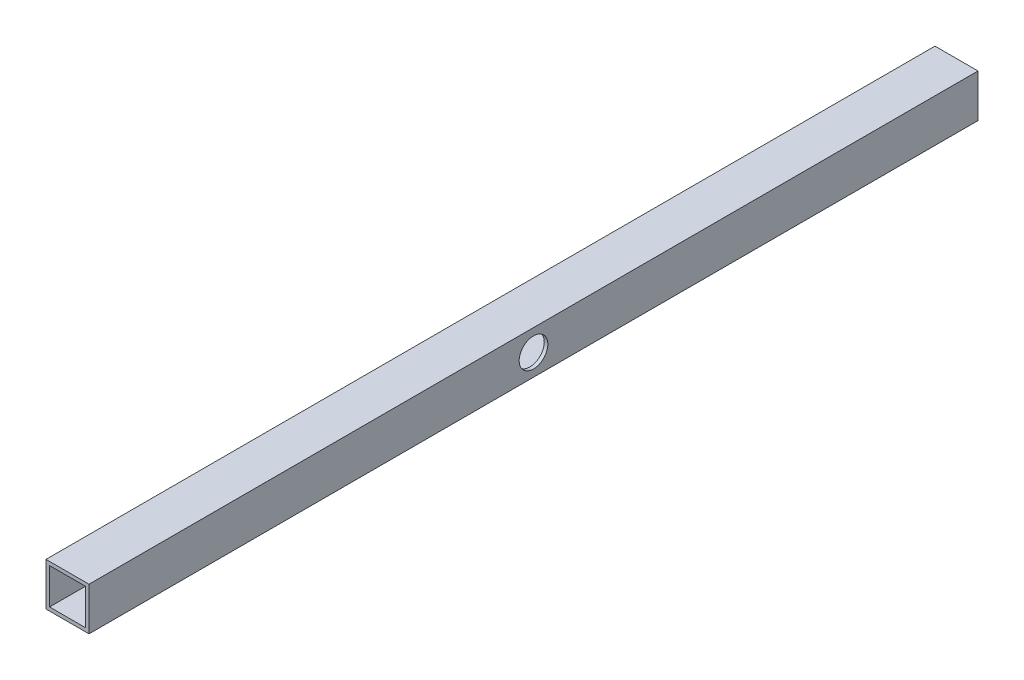
ISO-10303-21;
HEADER;
FILE_DESCRIPTION(('STEP AP214'),'2;1');
FILE_NAME('part.step','',(''),(''),'','','');
FILE_SCHEMA(('AUTOMOTIVE_DESIGN { 1 0 10303 214 1 1 1 1 }'));
ENDSEC;
DATA;
#1=APPLICATION_CONTEXT('core data for automotive mechanical design processes');
#2=APPLICATION_PROTOCOL_DEFINITION('international standard','automotive_design',2000,#1);
#3=PRODUCT_CONTEXT('',#1,'mechanical');
#4=PRODUCT('Part','Part','',(#3));
#5=PRODUCT_RELATED_PRODUCT_CATEGORY('part','',(#4));
#6=PRODUCT_DEFINITION_FORMATION('','',#4);
#7=PRODUCT_DEFINITION_CONTEXT('part definition',#1,'design');
#8=PRODUCT_DEFINITION('design','',#6,#7);
#9=PRODUCT_DEFINITION_SHAPE('','',#8);
#10=(LENGTH_UNIT() NAMED_UNIT(*) SI_UNIT(.MILLI.,.METRE.));
#11=(NAMED_UNIT(*) PLANE_ANGLE_UNIT() SI_UNIT($,.RADIAN.));
#12=(NAMED_UNIT(*) SI_UNIT($,.STERADIAN.) SOLID_ANGLE_UNIT());
#13=UNCERTAINTY_MEASURE_WITH_UNIT(LENGTH_MEASURE(1.E-05),#10,'distance_accuracy_value','');
#14=(GEOMETRIC_REPRESENTATION_CONTEXT(3) GLOBAL_UNCERTAINTY_ASSIGNED_CONTEXT((#13)) GLOBAL_UNIT_ASSIGNED_CONTEXT((#10,
#11,#12)) REPRESENTATION_CONTEXT('',''));
#15=CARTESIAN_POINT('',(0.,0.,0.));
#16=DIRECTION('',(0.,0.,1.));
#17=DIRECTION('',(1.,0.,0.));
#18=AXIS2_PLACEMENT_3D('',#15,#16,#17);
#19=CARTESIAN_POINT('',(0.,0.,196.85));
#20=DIRECTION('',(0.,0.,-1.));
#21=DIRECTION('',(-1.,0.,0.));
#22=AXIS2_PLACEMENT_3D('',#19,#20,#21);
#23=PLANE('',#22);
#24=DIRECTION('',(0.,1.,0.));
#25=VECTOR('',#24,1.);
#26=CARTESIAN_POINT('',(9.525,-9.525,196.85));
#27=LINE('',#26,#25);
#28=CARTESIAN_POINT('',(9.525,-9.525,196.85));
#29=VERTEX_POINT('',#28);
#30=CARTESIAN_POINT('',(9.525,9.525,196.85));
#31=VERTEX_POINT('',#30);
#32=EDGE_CURVE('E137',#29,#31,#27,.T.);
#33=ORIENTED_EDGE('',*,*,#32,.T.);
#34=DIRECTION('',(-1.,0.,0.));
#35=VECTOR('',#34,1.);
#36=CARTESIAN_POINT('',(-9.525,9.525,196.85));
#37=LINE('',#36,#35);
#38=CARTESIAN_POINT('',(-9.525,9.525,196.85));
#39=VERTEX_POINT('',#38);
#40=EDGE_CURVE('E140',#31,#39,#37,.T.);
#41=ORIENTED_EDGE('',*,*,#40,.T.);
#42=DIRECTION('',(0.,-1.,0.));
#43=VECTOR('',#42,1.);
#44=CARTESIAN_POINT('',(-9.525,-9.525,196.85));
#45=LINE('',#44,#43);
#46=CARTESIAN_POINT('',(-9.525,-9.525,196.85));
#47=VERTEX_POINT('',#46);
#48=EDGE_CURVE('E143',#39,#47,#45,.T.);
#49=ORIENTED_EDGE('',*,*,#48,.T.);
#50=DIRECTION('',(1.,0.,0.));
#51=VECTOR('',#50,1.);
#52=CARTESIAN_POINT('',(-9.525,-9.525,196.85));
#53=LINE('',#52,#51);
#54=EDGE_CURVE('E145',#47,#29,#53,.T.);
#55=ORIENTED_EDGE('',*,*,#54,.T.);
#56=EDGE_LOOP('',(#33,#41,#49,#55));
#57=FACE_BOUND('',#56,.T.);
#58=DIRECTION('',(0.,1.,0.));
#59=VECTOR('',#58,1.);
#60=CARTESIAN_POINT('',(7.9375,-7.9375,196.85));
#61=LINE('',#60,#59);
#62=CARTESIAN_POINT('',(7.9375,-7.9375,196.85));
#63=VERTEX_POINT('',#62);
#64=CARTESIAN_POINT('',(7.9375,7.9375,196.85));
#65=VERTEX_POINT('',#64);
#66=EDGE_CURVE('E99',#63,#65,#61,.T.);
#67=ORIENTED_EDGE('',*,*,#66,.F.);
#68=DIRECTION('',(1.,0.,0.));
#69=VECTOR('',#68,1.);
#70=CARTESIAN_POINT('',(-7.9375,-7.9375,196.85));
#71=LINE('',#70,#69);
#72=CARTESIAN_POINT('',(-7.9375,-7.9375,196.85));
#73=VERTEX_POINT('',#72);
#74=EDGE_CURVE('E121',#73,#63,#71,.T.);
#75=ORIENTED_EDGE('',*,*,#74,.F.);
#76=DIRECTION('',(0.,-1.,0.));
#77=VECTOR('',#76,1.);
#78=CARTESIAN_POINT('',(-7.9375,-7.9375,196.85));
#79=LINE('',#78,#77);
#80=CARTESIAN_POINT('',(-7.9375,7.9375,196.85));
#81=VERTEX_POINT('',#80);
#82=EDGE_CURVE('E119',#81,#73,#79,.T.);
#83=ORIENTED_EDGE('',*,*,#82,.F.);
#84=DIRECTION('',(-1.,0.,0.));
#85=VECTOR('',#84,1.);
#86=CARTESIAN_POINT('',(-7.9375,7.9375,196.85));
#87=LINE('',#86,#85);
#88=EDGE_CURVE('E107',#65,#81,#87,.T.);
#89=ORIENTED_EDGE('',*,*,#88,.F.);
#90=EDGE_LOOP('',(#67,#75,#83,#89));
#91=FACE_BOUND('',#90,.T.);
#92=ADVANCED_FACE('F33',(#57,#91),#23,.F.);
#93=CARTESIAN_POINT('',(0.,0.,-196.85));
#94=DIRECTION('',(0.,0.,-1.));
#95=DIRECTION('',(-1.,0.,0.));
#96=AXIS2_PLACEMENT_3D('',#93,#94,#95);
#97=PLANE('',#96);
#98=DIRECTION('',(0.,1.,0.));
#99=VECTOR('',#98,1.);
#100=CARTESIAN_POINT('',(9.525,-9.525,-196.85));
#101=LINE('',#100,#99);
#102=CARTESIAN_POINT('',(9.525,-9.525,-196.85));
#103=VERTEX_POINT('',#102);
#104=CARTESIAN_POINT('',(9.525,9.525,-196.85));
#105=VERTEX_POINT('',#104);
#106=EDGE_CURVE('E115',#103,#105,#101,.T.);
#107=ORIENTED_EDGE('',*,*,#106,.F.);
#108=DIRECTION('',(1.,0.,0.));
#109=VECTOR('',#108,1.);
#110=CARTESIAN_POINT('',(-9.525,-9.525,-196.85));
#111=LINE('',#110,#109);
#112=CARTESIAN_POINT('',(-9.525,-9.525,-196.85));
#113=VERTEX_POINT('',#112);
#114=EDGE_CURVE('E141',#113,#103,#111,.T.);
#115=ORIENTED_EDGE('',*,*,#114,.F.);
#116=DIRECTION('',(0.,-1.,0.));
#117=VECTOR('',#116,1.);
#118=CARTESIAN_POINT('',(-9.525,-9.525,-196.85));
#119=LINE('',#118,#117);
#120=CARTESIAN_POINT('',(-9.525,9.525,-196.85));
#121=VERTEX_POINT('',#120);
#122=EDGE_CURVE('E152',#121,#113,#119,.T.);
#123=ORIENTED_EDGE('',*,*,#122,.F.);
#124=DIRECTION('',(-1.,0.,0.));
#125=VECTOR('',#124,1.);
#126=CARTESIAN_POINT('',(-9.525,9.525,-196.85));
#127=LINE('',#126,#125);
#128=EDGE_CURVE('E150',#105,#121,#127,.T.);
#129=ORIENTED_EDGE('',*,*,#128,.F.);
#130=EDGE_LOOP('',(#107,#115,#123,#129));
#131=FACE_BOUND('',#130,.T.);
#132=DIRECTION('',(1.,0.,0.));
#133=VECTOR('',#132,1.);
#134=CARTESIAN_POINT('',(-7.9375,-7.9375,-196.85));
#135=LINE('',#134,#133);
#136=CARTESIAN_POINT('',(-7.9375,-7.9375,-196.85));
#137=VERTEX_POINT('',#136);
#138=CARTESIAN_POINT('',(7.9375,-7.9375,-196.85));
#139=VERTEX_POINT('',#138);
#140=EDGE_CURVE('E108',#137,#139,#135,.T.);
#141=ORIENTED_EDGE('',*,*,#140,.T.);
#142=DIRECTION('',(0.,1.,0.));
#143=VECTOR('',#142,1.);
#144=CARTESIAN_POINT('',(7.9375,-7.9375,-196.85));
#145=LINE('',#144,#143);
#146=CARTESIAN_POINT('',(7.9375,7.9375,-196.85));
#147=VERTEX_POINT('',#146);
#148=EDGE_CURVE('E57',#139,#147,#145,.T.);
#149=ORIENTED_EDGE('',*,*,#148,.T.);
#150=DIRECTION('',(-1.,0.,0.));
#151=VECTOR('',#150,1.);
#152=CARTESIAN_POINT('',(-7.9375,7.9375,-196.85));
#153=LINE('',#152,#151);
#154=CARTESIAN_POINT('',(-7.9375,7.9375,-196.85));
#155=VERTEX_POINT('',#154);
#156=EDGE_CURVE('E114',#147,#155,#153,.T.);
#157=ORIENTED_EDGE('',*,*,#156,.T.);
#158=DIRECTION('',(0.,-1.,0.));
#159=VECTOR('',#158,1.);
#160=CARTESIAN_POINT('',(-7.9375,-7.9375,-196.85));
#161=LINE('',#160,#159);
#162=EDGE_CURVE('E129',#155,#137,#161,.T.);
#163=ORIENTED_EDGE('',*,*,#162,.T.);
#164=EDGE_LOOP('',(#141,#149,#157,#163));
#165=FACE_BOUND('',#164,.T.);
#166=ADVANCED_FACE('F171',(#131,#165),#97,.T.);
#167=CARTESIAN_POINT('',(9.525,-9.525,196.85));
#168=DIRECTION('',(-1.,0.,0.));
#169=DIRECTION('',(0.,0.,1.));
#170=AXIS2_PLACEMENT_3D('',#167,#168,#169);
#171=PLANE('',#170);
#172=CARTESIAN_POINT('',(9.525,0.,0.));
#173=DIRECTION('',(1.,0.,0.));
#174=DIRECTION('',(0.,0.,-1.));
#175=AXIS2_PLACEMENT_3D('',#172,#173,#174);
#176=CIRCLE('',#175,6.35);
#177=CARTESIAN_POINT('',(9.525,0.,-6.35));
#178=VERTEX_POINT('',#177);
#179=EDGE_CURVE('E219',#178,#178,#176,.T.);
#180=ORIENTED_EDGE('',*,*,#179,.F.);
#181=EDGE_LOOP('',(#180));
#182=FACE_BOUND('',#181,.T.);
#183=ORIENTED_EDGE('',*,*,#106,.T.);
#184=DIRECTION('',(0.,0.,-1.));
#185=VECTOR('',#184,1.);
#186=CARTESIAN_POINT('',(9.525,9.525,196.85));
#187=LINE('',#186,#185);
#188=EDGE_CURVE('E11',#31,#105,#187,.T.);
#189=ORIENTED_EDGE('',*,*,#188,.F.);
#190=ORIENTED_EDGE('',*,*,#32,.F.);
#191=DIRECTION('',(0.,0.,-1.));
#192=VECTOR('',#191,1.);
#193=CARTESIAN_POINT('',(9.525,-9.525,196.85));
#194=LINE('',#193,#192);
#195=EDGE_CURVE('E147',#29,#103,#194,.T.);
#196=ORIENTED_EDGE('',*,*,#195,.T.);
#197=EDGE_LOOP('',(#183,#189,#190,#196));
#198=FACE_BOUND('',#197,.T.);
#199=ADVANCED_FACE('F35',(#182,#198),#171,.F.);
#200=CARTESIAN_POINT('',(-9.525,9.525,196.85));
#201=DIRECTION('',(0.,-1.,0.));
#202=DIRECTION('',(0.,0.,-1.));
#203=AXIS2_PLACEMENT_3D('',#200,#201,#202);
#204=PLANE('',#203);
#205=ORIENTED_EDGE('',*,*,#128,.T.);
#206=DIRECTION('',(0.,0.,-1.));
#207=VECTOR('',#206,1.);
#208=CARTESIAN_POINT('',(-9.525,9.525,196.85));
#209=LINE('',#208,#207);
#210=EDGE_CURVE('E42',#39,#121,#209,.T.);
#211=ORIENTED_EDGE('',*,*,#210,.F.);
#212=ORIENTED_EDGE('',*,*,#40,.F.);
#213=ORIENTED_EDGE('',*,*,#188,.T.);
#214=EDGE_LOOP('',(#205,#211,#212,#213));
#215=FACE_BOUND('',#214,.T.);
#216=ADVANCED_FACE('F181',(#215),#204,.F.);
#217=CARTESIAN_POINT('',(-9.525,-9.525,196.85));
#218=DIRECTION('',(1.,0.,0.));
#219=DIRECTION('',(0.,0.,-1.));
#220=AXIS2_PLACEMENT_3D('',#217,#218,#219);
#221=PLANE('',#220);
#222=CARTESIAN_POINT('',(-9.525,0.,0.));
#223=DIRECTION('',(1.,0.,0.));
#224=DIRECTION('',(0.,0.,-1.));
#225=AXIS2_PLACEMENT_3D('',#222,#223,#224);
#226=CIRCLE('',#225,6.35);
#227=CARTESIAN_POINT('',(-9.525,0.,-6.35));
#228=VERTEX_POINT('',#227);
#229=EDGE_CURVE('E215',#228,#228,#226,.T.);
#230=ORIENTED_EDGE('',*,*,#229,.T.);
#231=EDGE_LOOP('',(#230));
#232=FACE_BOUND('',#231,.T.);
#233=ORIENTED_EDGE('',*,*,#122,.T.);
#234=DIRECTION('',(0.,0.,-1.));
#235=VECTOR('',#234,1.);
#236=CARTESIAN_POINT('',(-9.525,-9.525,196.85));
#237=LINE('',#236,#235);
#238=EDGE_CURVE('E157',#47,#113,#237,.T.);
#239=ORIENTED_EDGE('',*,*,#238,.F.);
#240=ORIENTED_EDGE('',*,*,#48,.F.);
#241=ORIENTED_EDGE('',*,*,#210,.T.);
#242=EDGE_LOOP('',(#233,#239,#240,#241));
#243=FACE_BOUND('',#242,.T.);
#244=ADVANCED_FACE('F165',(#232,#243),#221,.F.);
#245=CARTESIAN_POINT('',(-9.525,-9.525,196.85));
#246=DIRECTION('',(0.,1.,0.));
#247=DIRECTION('',(0.,0.,1.));
#248=AXIS2_PLACEMENT_3D('',#245,#246,#247);
#249=PLANE('',#248);
#250=ORIENTED_EDGE('',*,*,#114,.T.);
#251=ORIENTED_EDGE('',*,*,#195,.F.);
#252=ORIENTED_EDGE('',*,*,#54,.F.);
#253=ORIENTED_EDGE('',*,*,#238,.T.);
#254=EDGE_LOOP('',(#250,#251,#252,#253));
#255=FACE_BOUND('',#254,.T.);
#256=ADVANCED_FACE('F175',(#255),#249,.F.);
#257=CARTESIAN_POINT('',(7.9375,-7.9375,196.85));
#258=DIRECTION('',(-1.,0.,0.));
#259=DIRECTION('',(0.,-1.,0.));
#260=AXIS2_PLACEMENT_3D('',#257,#258,#259);
#261=PLANE('',#260);
#262=CARTESIAN_POINT('',(7.9375,0.,0.));
#263=DIRECTION('',(-1.,0.,0.));
#264=DIRECTION('',(0.,-1.,0.));
#265=AXIS2_PLACEMENT_3D('',#262,#263,#264);
#266=CIRCLE('',#265,6.35);
#267=CARTESIAN_POINT('',(7.9375,0.,-6.35));
#268=VERTEX_POINT('',#267);
#269=EDGE_CURVE('E127',#268,#268,#266,.T.);
#270=ORIENTED_EDGE('',*,*,#269,.F.);
#271=EDGE_LOOP('',(#270));
#272=FACE_BOUND('',#271,.T.);
#273=ORIENTED_EDGE('',*,*,#148,.F.);
#274=DIRECTION('',(0.,0.,-1.));
#275=VECTOR('',#274,1.);
#276=CARTESIAN_POINT('',(7.9375,-7.9375,196.85));
#277=LINE('',#276,#275);
#278=EDGE_CURVE('E103',#63,#139,#277,.T.);
#279=ORIENTED_EDGE('',*,*,#278,.F.);
#280=ORIENTED_EDGE('',*,*,#66,.T.);
#281=DIRECTION('',(0.,0.,-1.));
#282=VECTOR('',#281,1.);
#283=CARTESIAN_POINT('',(7.9375,7.9375,196.85));
#284=LINE('',#283,#282);
#285=EDGE_CURVE('E102',#65,#147,#284,.T.);
#286=ORIENTED_EDGE('',*,*,#285,.T.);
#287=EDGE_LOOP('',(#273,#279,#280,#286));
#288=FACE_BOUND('',#287,.T.);
#289=ADVANCED_FACE('F101',(#272,#288),#261,.T.);
#290=CARTESIAN_POINT('',(-7.9375,7.9375,196.85));
#291=DIRECTION('',(0.,-1.,0.));
#292=DIRECTION('',(0.,0.,-1.));
#293=AXIS2_PLACEMENT_3D('',#290,#291,#292);
#294=PLANE('',#293);
#295=ORIENTED_EDGE('',*,*,#156,.F.);
#296=ORIENTED_EDGE('',*,*,#285,.F.);
#297=ORIENTED_EDGE('',*,*,#88,.T.);
#298=DIRECTION('',(0.,0.,-1.));
#299=VECTOR('',#298,1.);
#300=CARTESIAN_POINT('',(-7.9375,7.9375,196.85));
#301=LINE('',#300,#299);
#302=EDGE_CURVE('E116',#81,#155,#301,.T.);
#303=ORIENTED_EDGE('',*,*,#302,.T.);
#304=EDGE_LOOP('',(#295,#296,#297,#303));
#305=FACE_BOUND('',#304,.T.);
#306=ADVANCED_FACE('F111',(#305),#294,.T.);
#307=CARTESIAN_POINT('',(-7.9375,-7.9375,196.85));
#308=DIRECTION('',(1.,0.,0.));
#309=DIRECTION('',(0.,0.,-1.));
#310=AXIS2_PLACEMENT_3D('',#307,#308,#309);
#311=PLANE('',#310);
#312=CARTESIAN_POINT('',(-7.9375,0.,0.));
#313=DIRECTION('',(1.,0.,0.));
#314=DIRECTION('',(0.,0.,-1.));
#315=AXIS2_PLACEMENT_3D('',#312,#313,#314);
#316=CIRCLE('',#315,6.35);
#317=CARTESIAN_POINT('',(-7.9375,0.,-6.35));
#318=VERTEX_POINT('',#317);
#319=EDGE_CURVE('E37',#318,#318,#316,.T.);
#320=ORIENTED_EDGE('',*,*,#319,.F.);
#321=EDGE_LOOP('',(#320));
#322=FACE_BOUND('',#321,.T.);
#323=ORIENTED_EDGE('',*,*,#162,.F.);
#324=ORIENTED_EDGE('',*,*,#302,.F.);
#325=ORIENTED_EDGE('',*,*,#82,.T.);
#326=DIRECTION('',(0.,0.,-1.));
#327=VECTOR('',#326,1.);
#328=CARTESIAN_POINT('',(-7.9375,-7.9375,196.85));
#329=LINE('',#328,#327);
#330=EDGE_CURVE('E49',#73,#137,#329,.T.);
#331=ORIENTED_EDGE('',*,*,#330,.T.);
#332=EDGE_LOOP('',(#323,#324,#325,#331));
#333=FACE_BOUND('',#332,.T.);
#334=ADVANCED_FACE('F210',(#322,#333),#311,.T.);
#335=CARTESIAN_POINT('',(-7.9375,-7.9375,196.85));
#336=DIRECTION('',(0.,1.,0.));
#337=DIRECTION('',(0.,0.,1.));
#338=AXIS2_PLACEMENT_3D('',#335,#336,#337);
#339=PLANE('',#338);
#340=ORIENTED_EDGE('',*,*,#140,.F.);
#341=ORIENTED_EDGE('',*,*,#330,.F.);
#342=ORIENTED_EDGE('',*,*,#74,.T.);
#343=ORIENTED_EDGE('',*,*,#278,.T.);
#344=EDGE_LOOP('',(#340,#341,#342,#343));
#345=FACE_BOUND('',#344,.T.);
#346=ADVANCED_FACE('F230',(#345),#339,.T.);
#347=CARTESIAN_POINT('',(-9.525,0.,0.));
#348=DIRECTION('',(1.,0.,0.));
#349=DIRECTION('',(0.,0.,-1.));
#350=AXIS2_PLACEMENT_3D('',#347,#348,#349);
#351=CYLINDRICAL_SURFACE('',#350,6.35);
#352=CARTESIAN_POINT('',(-7.9375,0.,-6.35));
#353=CARTESIAN_POINT('',(-7.95403645833333,0.,-6.35));
#354=CARTESIAN_POINT('',(-7.97057291666667,0.,-6.35));
#355=CARTESIAN_POINT('',(-8.00364583333334,0.,-6.35));
#356=CARTESIAN_POINT('',(-8.02018229166667,0.,-6.35));
#357=CARTESIAN_POINT('',(-8.05325520833333,0.,-6.35));
#358=CARTESIAN_POINT('',(-8.06979166666667,0.,-6.35));
#359=CARTESIAN_POINT('',(-8.10286458333333,0.,-6.35));
#360=CARTESIAN_POINT('',(-8.11940104166667,0.,-6.35));
#361=CARTESIAN_POINT('',(-8.15247395833333,0.,-6.35));
#362=CARTESIAN_POINT('',(-8.16901041666667,0.,-6.35));
#363=CARTESIAN_POINT('',(-8.20208333333334,0.,-6.35));
#364=CARTESIAN_POINT('',(-8.21861979166667,0.,-6.35));
#365=CARTESIAN_POINT('',(-8.25169270833333,0.,-6.35));
#366=CARTESIAN_POINT('',(-8.26822916666667,0.,-6.35));
#367=CARTESIAN_POINT('',(-8.30130208333333,0.,-6.35));
#368=CARTESIAN_POINT('',(-8.31783854166667,0.,-6.35));
#369=CARTESIAN_POINT('',(-8.35091145833333,0.,-6.35));
#370=CARTESIAN_POINT('',(-8.36744791666667,0.,-6.35));
#371=CARTESIAN_POINT('',(-8.40052083333333,0.,-6.35));
#372=CARTESIAN_POINT('',(-8.41705729166667,0.,-6.35));
#373=CARTESIAN_POINT('',(-8.45013020833333,0.,-6.35));
#374=CARTESIAN_POINT('',(-8.46666666666667,0.,-6.35));
#375=CARTESIAN_POINT('',(-8.49973958333333,0.,-6.35));
#376=CARTESIAN_POINT('',(-8.51627604166667,0.,-6.35));
#377=CARTESIAN_POINT('',(-8.54934895833333,0.,-6.35));
#378=CARTESIAN_POINT('',(-8.56588541666667,0.,-6.35));
#379=CARTESIAN_POINT('',(-8.59895833333334,0.,-6.35));
#380=CARTESIAN_POINT('',(-8.61549479166667,0.,-6.35));
#381=CARTESIAN_POINT('',(-8.64856770833333,0.,-6.35));
#382=CARTESIAN_POINT('',(-8.66510416666667,0.,-6.35));
#383=CARTESIAN_POINT('',(-8.69817708333333,0.,-6.35));
#384=CARTESIAN_POINT('',(-8.71471354166667,0.,-6.35));
#385=CARTESIAN_POINT('',(-8.74778645833334,0.,-6.35));
#386=CARTESIAN_POINT('',(-8.76432291666667,0.,-6.35));
#387=CARTESIAN_POINT('',(-8.79739583333333,0.,-6.35));
#388=CARTESIAN_POINT('',(-8.81393229166667,0.,-6.35));
#389=CARTESIAN_POINT('',(-8.84700520833333,0.,-6.35));
#390=CARTESIAN_POINT('',(-8.86354166666667,0.,-6.35));
#391=CARTESIAN_POINT('',(-8.89661458333333,0.,-6.35));
#392=CARTESIAN_POINT('',(-8.91315104166667,0.,-6.35));
#393=CARTESIAN_POINT('',(-8.94622395833333,0.,-6.35));
#394=CARTESIAN_POINT('',(-8.96276041666667,0.,-6.35));
#395=CARTESIAN_POINT('',(-8.99583333333334,0.,-6.35));
#396=CARTESIAN_POINT('',(-9.01236979166667,0.,-6.35));
#397=CARTESIAN_POINT('',(-9.04544270833333,0.,-6.35));
#398=CARTESIAN_POINT('',(-9.06197916666667,0.,-6.35));
#399=CARTESIAN_POINT('',(-9.09505208333333,0.,-6.35));
#400=CARTESIAN_POINT('',(-9.11158854166667,0.,-6.35));
#401=CARTESIAN_POINT('',(-9.14466145833333,0.,-6.35));
#402=CARTESIAN_POINT('',(-9.16119791666667,0.,-6.35));
#403=CARTESIAN_POINT('',(-9.19427083333334,0.,-6.35));
#404=CARTESIAN_POINT('',(-9.21080729166667,0.,-6.35));
#405=CARTESIAN_POINT('',(-9.24388020833333,0.,-6.35));
#406=CARTESIAN_POINT('',(-9.26041666666667,0.,-6.35));
#407=CARTESIAN_POINT('',(-9.29348958333333,0.,-6.35));
#408=CARTESIAN_POINT('',(-9.31002604166667,0.,-6.35));
#409=CARTESIAN_POINT('',(-9.34309895833334,0.,-6.35));
#410=CARTESIAN_POINT('',(-9.35963541666667,0.,-6.35));
#411=CARTESIAN_POINT('',(-9.39270833333333,0.,-6.35));
#412=CARTESIAN_POINT('',(-9.40924479166667,0.,-6.35));
#413=CARTESIAN_POINT('',(-9.44231770833333,0.,-6.35));
#414=CARTESIAN_POINT('',(-9.45885416666667,0.,-6.35));
#415=CARTESIAN_POINT('',(-9.49192708333333,0.,-6.35));
#416=CARTESIAN_POINT('',(-9.50846354166667,0.,-6.35));
#417=CARTESIAN_POINT('',(-9.525,0.,-6.35));
#418=B_SPLINE_CURVE_WITH_KNOTS('',3,(#352,#353,#354,#355,#356,#357,#358,#359,#360,#361,#362,
#363,#364,#365,#366,#367,#368,#369,#370,#371,#372,#373,#374,#375,#376,#377,#378,#379,#380,#381,
#382,#383,#384,#385,#386,#387,#388,#389,#390,#391,#392,#393,#394,#395,#396,#397,#398,#399,#400,
#401,#402,#403,#404,#405,#406,#407,#408,#409,#410,#411,#412,#413,#414,#415,#416,#417),
.UNSPECIFIED.,.F.,.F.,(4,2,2,2,2,2,2,2,2,2,2,2,2,2,2,2,2,2,2,2,2,2,2,2,2,2,2,2,2,2,2,2,4),(0.,
0.0496093749999989,0.0992187499999995,0.148828125,0.198437499999999,0.248046875,0.29765625,
0.347265624999999,0.396875,0.446484374999999,0.496093749999999,0.545703125,0.595312499999999,
0.644921874999999,0.69453125,0.744140624999999,0.793749999999999,0.843359375,0.892968749999999,
0.942578124999999,0.9921875,1.041796875,1.09140625,1.141015625,1.190625,1.240234375,1.28984375,
1.339453125,1.3890625,1.438671875,1.48828125,1.537890625,1.5875),.UNSPECIFIED.);
#419=EDGE_CURVE('BSEAM225',#318,#228,#418,.T.);
#420=ORIENTED_EDGE('',*,*,#319,.T.);
#421=ORIENTED_EDGE('',*,*,#229,.F.);
#422=ORIENTED_EDGE('',*,*,#419,.T.);
#423=ORIENTED_EDGE('',*,*,#419,.F.);
#424=EDGE_LOOP('',(#420,#422,#421,#423));
#425=FACE_BOUND('',#424,.T.);
#426=ADVANCED_FACE('F225',(#425),#351,.F.);
#427=CARTESIAN_POINT('',(7.9375,0.,-6.35));
#428=CARTESIAN_POINT('',(7.95403645833333,0.,-6.35));
#429=CARTESIAN_POINT('',(7.97057291666667,0.,-6.35));
#430=CARTESIAN_POINT('',(8.00364583333334,0.,-6.35));
#431=CARTESIAN_POINT('',(8.02018229166667,0.,-6.35));
#432=CARTESIAN_POINT('',(8.05325520833333,0.,-6.35));
#433=CARTESIAN_POINT('',(8.06979166666667,0.,-6.35));
#434=CARTESIAN_POINT('',(8.10286458333333,0.,-6.35));
#435=CARTESIAN_POINT('',(8.11940104166667,0.,-6.35));
#436=CARTESIAN_POINT('',(8.15247395833333,0.,-6.35));
#437=CARTESIAN_POINT('',(8.16901041666667,0.,-6.35));
#438=CARTESIAN_POINT('',(8.20208333333334,0.,-6.35));
#439=CARTESIAN_POINT('',(8.21861979166667,0.,-6.35));
#440=CARTESIAN_POINT('',(8.25169270833333,0.,-6.35));
#441=CARTESIAN_POINT('',(8.26822916666667,0.,-6.35));
#442=CARTESIAN_POINT('',(8.30130208333333,0.,-6.35));
#443=CARTESIAN_POINT('',(8.31783854166667,0.,-6.35));
#444=CARTESIAN_POINT('',(8.35091145833333,0.,-6.35));
#445=CARTESIAN_POINT('',(8.36744791666667,0.,-6.35));
#446=CARTESIAN_POINT('',(8.40052083333333,0.,-6.35));
#447=CARTESIAN_POINT('',(8.41705729166667,0.,-6.35));
#448=CARTESIAN_POINT('',(8.45013020833333,0.,-6.35));
#449=CARTESIAN_POINT('',(8.46666666666667,0.,-6.35));
#450=CARTESIAN_POINT('',(8.49973958333333,0.,-6.35));
#451=CARTESIAN_POINT('',(8.51627604166667,0.,-6.35));
#452=CARTESIAN_POINT('',(8.54934895833333,0.,-6.35));
#453=CARTESIAN_POINT('',(8.56588541666667,0.,-6.35));
#454=CARTESIAN_POINT('',(8.59895833333333,0.,-6.35));
#455=CARTESIAN_POINT('',(8.61549479166667,0.,-6.35));
#456=CARTESIAN_POINT('',(8.64856770833333,0.,-6.35));
#457=CARTESIAN_POINT('',(8.66510416666667,0.,-6.35));
#458=CARTESIAN_POINT('',(8.69817708333333,0.,-6.35));
#459=CARTESIAN_POINT('',(8.71471354166667,0.,-6.35));
#460=CARTESIAN_POINT('',(8.74778645833333,0.,-6.35));
#461=CARTESIAN_POINT('',(8.76432291666667,0.,-6.35));
#462=CARTESIAN_POINT('',(8.79739583333333,0.,-6.35));
#463=CARTESIAN_POINT('',(8.81393229166667,0.,-6.35));
#464=CARTESIAN_POINT('',(8.84700520833333,0.,-6.35));
#465=CARTESIAN_POINT('',(8.86354166666667,0.,-6.35));
#466=CARTESIAN_POINT('',(8.89661458333333,0.,-6.35));
#467=CARTESIAN_POINT('',(8.91315104166667,0.,-6.35));
#468=CARTESIAN_POINT('',(8.94622395833333,0.,-6.35));
#469=CARTESIAN_POINT('',(8.96276041666667,0.,-6.35));
#470=CARTESIAN_POINT('',(8.99583333333334,0.,-6.35));
#471=CARTESIAN_POINT('',(9.01236979166667,0.,-6.35));
#472=CARTESIAN_POINT('',(9.04544270833333,0.,-6.35));
#473=CARTESIAN_POINT('',(9.06197916666667,0.,-6.35));
#474=CARTESIAN_POINT('',(9.09505208333333,0.,-6.35));
#475=CARTESIAN_POINT('',(9.11158854166667,0.,-6.35));
#476=CARTESIAN_POINT('',(9.14466145833333,0.,-6.35));
#477=CARTESIAN_POINT('',(9.16119791666667,0.,-6.35));
#478=CARTESIAN_POINT('',(9.19427083333333,0.,-6.35));
#479=CARTESIAN_POINT('',(9.21080729166667,0.,-6.35));
#480=CARTESIAN_POINT('',(9.24388020833333,0.,-6.35));
#481=CARTESIAN_POINT('',(9.26041666666667,0.,-6.35));
#482=CARTESIAN_POINT('',(9.29348958333333,0.,-6.35));
#483=CARTESIAN_POINT('',(9.31002604166667,0.,-6.35));
#484=CARTESIAN_POINT('',(9.34309895833333,0.,-6.35));
#485=CARTESIAN_POINT('',(9.35963541666667,0.,-6.35));
#486=CARTESIAN_POINT('',(9.39270833333333,0.,-6.35));
#487=CARTESIAN_POINT('',(9.40924479166667,0.,-6.35));
#488=CARTESIAN_POINT('',(9.44231770833333,0.,-6.35));
#489=CARTESIAN_POINT('',(9.45885416666667,0.,-6.35));
#490=CARTESIAN_POINT('',(9.49192708333333,0.,-6.35));
#491=CARTESIAN_POINT('',(9.50846354166667,0.,-6.35));
#492=CARTESIAN_POINT('',(9.525,0.,-6.35));
#493=B_SPLINE_CURVE_WITH_KNOTS('',3,(#427,#428,#429,#430,#431,#432,#433,#434,#435,#436,#437,
#438,#439,#440,#441,#442,#443,#444,#445,#446,#447,#448,#449,#450,#451,#452,#453,#454,#455,#456,
#457,#458,#459,#460,#461,#462,#463,#464,#465,#466,#467,#468,#469,#470,#471,#472,#473,#474,#475,
#476,#477,#478,#479,#480,#481,#482,#483,#484,#485,#486,#487,#488,#489,#490,#491,#492),
.UNSPECIFIED.,.F.,.F.,(4,2,2,2,2,2,2,2,2,2,2,2,2,2,2,2,2,2,2,2,2,2,2,2,2,2,2,2,2,2,2,2,4),(0.,
0.0496093749999989,0.0992187500000012,0.148828125,0.198437499999999,0.248046875000001,
0.29765625,0.347265624999999,0.396874999999998,0.446484375,0.496093749999999,0.545703124999998,
0.5953125,0.644921874999999,0.694531249999998,0.744140625,0.793749999999999,0.843359374999998,
0.892968750000001,0.942578124999999,0.992187499999998,1.041796875,1.09140625,1.141015625,
1.190625,1.240234375,1.28984375,1.339453125,1.3890625,1.438671875,1.48828125,1.537890625,
1.5875),.UNSPECIFIED.);
#494=EDGE_CURVE('BSEAM223',#268,#178,#493,.T.);
#495=ORIENTED_EDGE('',*,*,#269,.T.);
#496=ORIENTED_EDGE('',*,*,#179,.T.);
#497=ORIENTED_EDGE('',*,*,#494,.T.);
#498=ORIENTED_EDGE('',*,*,#494,.F.);
#499=EDGE_LOOP('',(#495,#497,#496,#498));
#500=FACE_BOUND('',#499,.T.);
#501=ADVANCED_FACE('F223',(#500),#351,.F.);
#502=CLOSED_SHELL('',(#92,#166,#199,#216,#244,#256,#289,#306,#334,#346,#426,#501));
#503=MANIFOLD_SOLID_BREP('B2',#502);
#504=ADVANCED_BREP_SHAPE_REPRESENTATION('',(#18,#503),#14);
#505=SHAPE_DEFINITION_REPRESENTATION(#9,#504);
ENDSEC;
END-ISO-10303-21;
